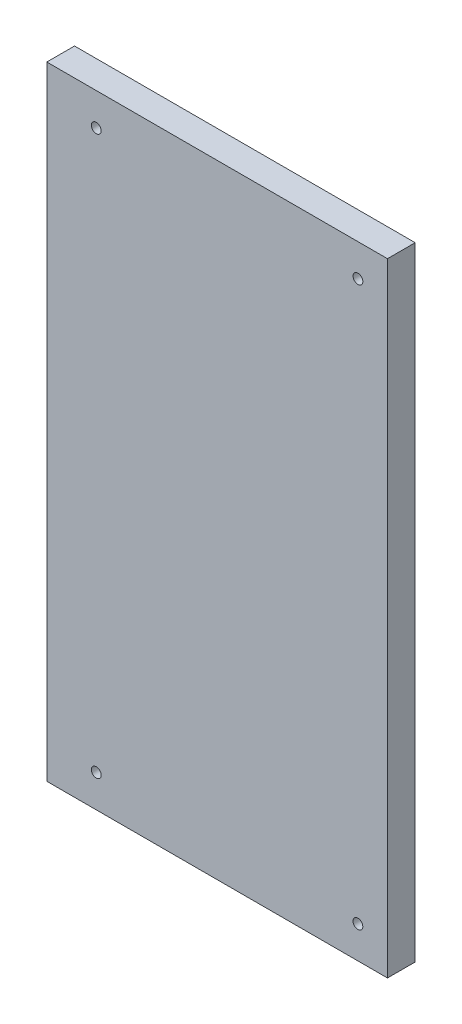
ISO-10303-21;
HEADER;
FILE_DESCRIPTION(('STEP AP214'),'2;1');
FILE_NAME('part.step','',(''),(''),'','','');
FILE_SCHEMA(('AUTOMOTIVE_DESIGN { 1 0 10303 214 1 1 1 1 }'));
ENDSEC;
DATA;
#1=APPLICATION_CONTEXT('core data for automotive mechanical design processes');
#2=APPLICATION_PROTOCOL_DEFINITION('international standard','automotive_design',2000,#1);
#3=PRODUCT_CONTEXT('',#1,'mechanical');
#4=PRODUCT('Part','Part','',(#3));
#5=PRODUCT_RELATED_PRODUCT_CATEGORY('part','',(#4));
#6=PRODUCT_DEFINITION_FORMATION('','',#4);
#7=PRODUCT_DEFINITION_CONTEXT('part definition',#1,'design');
#8=PRODUCT_DEFINITION('design','',#6,#7);
#9=PRODUCT_DEFINITION_SHAPE('','',#8);
#10=(LENGTH_UNIT() NAMED_UNIT(*) SI_UNIT(.MILLI.,.METRE.));
#11=(NAMED_UNIT(*) PLANE_ANGLE_UNIT() SI_UNIT($,.RADIAN.));
#12=(NAMED_UNIT(*) SI_UNIT($,.STERADIAN.) SOLID_ANGLE_UNIT());
#13=UNCERTAINTY_MEASURE_WITH_UNIT(LENGTH_MEASURE(1.E-05),#10,'distance_accuracy_value','');
#14=(GEOMETRIC_REPRESENTATION_CONTEXT(3) GLOBAL_UNCERTAINTY_ASSIGNED_CONTEXT((#13)) GLOBAL_UNIT_ASSIGNED_CONTEXT((#10,
#11,#12)) REPRESENTATION_CONTEXT('',''));
#15=CARTESIAN_POINT('',(0.,0.,0.));
#16=DIRECTION('',(0.,0.,1.));
#17=DIRECTION('',(1.,0.,0.));
#18=AXIS2_PLACEMENT_3D('',#15,#16,#17);
#19=CARTESIAN_POINT('',(-386.5646525714,417.112499999991,19.05));
#20=DIRECTION('',(1.,0.,0.));
#21=DIRECTION('',(0.,1.,0.));
#22=AXIS2_PLACEMENT_3D('',#19,#20,#21);
#23=PLANE('',#22);
#24=DIRECTION('',(0.,-1.,0.));
#25=VECTOR('',#24,1.);
#26=CARTESIAN_POINT('',(-386.5646525714,417.112499999991,0.));
#27=LINE('',#26,#25);
#28=CARTESIAN_POINT('',(-386.5646525714,417.112499999991,0.));
#29=VERTEX_POINT('',#28);
#30=CARTESIAN_POINT('',(-386.5646525714,-11.1124999999999,0.));
#31=VERTEX_POINT('',#30);
#32=EDGE_CURVE('E103',#29,#31,#27,.T.);
#33=ORIENTED_EDGE('',*,*,#32,.T.);
#34=DIRECTION('',(0.,0.,-1.));
#35=VECTOR('',#34,1.);
#36=CARTESIAN_POINT('',(-386.5646525714,-11.1124999999999,19.05));
#37=LINE('',#36,#35);
#38=CARTESIAN_POINT('',(-386.5646525714,-11.1124999999999,19.05));
#39=VERTEX_POINT('',#38);
#40=EDGE_CURVE('E11',#39,#31,#37,.T.);
#41=ORIENTED_EDGE('',*,*,#40,.F.);
#42=DIRECTION('',(0.,-1.,0.));
#43=VECTOR('',#42,1.);
#44=CARTESIAN_POINT('',(-386.5646525714,417.112499999991,19.05));
#45=LINE('',#44,#43);
#46=CARTESIAN_POINT('',(-386.5646525714,417.112499999991,19.05));
#47=VERTEX_POINT('',#46);
#48=EDGE_CURVE('E90',#47,#39,#45,.T.);
#49=ORIENTED_EDGE('',*,*,#48,.F.);
#50=DIRECTION('',(0.,0.,-1.));
#51=VECTOR('',#50,1.);
#52=CARTESIAN_POINT('',(-386.5646525714,417.112499999991,19.05));
#53=LINE('',#52,#51);
#54=EDGE_CURVE('E99',#47,#29,#53,.T.);
#55=ORIENTED_EDGE('',*,*,#54,.T.);
#56=EDGE_LOOP('',(#33,#41,#49,#55));
#57=FACE_BOUND('',#56,.T.);
#58=ADVANCED_FACE('F37',(#57),#23,.F.);
#59=CARTESIAN_POINT('',(-386.5646525714,-11.1124999999999,19.05));
#60=DIRECTION('',(0.,1.,0.));
#61=DIRECTION('',(0.,0.,1.));
#62=AXIS2_PLACEMENT_3D('',#59,#60,#61);
#63=PLANE('',#62);
#64=DIRECTION('',(1.,0.,0.));
#65=VECTOR('',#64,1.);
#66=CARTESIAN_POINT('',(-386.5646525714,-11.1124999999999,0.));
#67=LINE('',#66,#65);
#68=CARTESIAN_POINT('',(-152.388223356161,-11.1124999999999,0.));
#69=VERTEX_POINT('',#68);
#70=EDGE_CURVE('E94',#31,#69,#67,.T.);
#71=ORIENTED_EDGE('',*,*,#70,.T.);
#72=DIRECTION('',(0.,0.,-1.));
#73=VECTOR('',#72,1.);
#74=CARTESIAN_POINT('',(-152.388223356161,-11.1124999999999,19.05));
#75=LINE('',#74,#73);
#76=CARTESIAN_POINT('',(-152.388223356161,-11.1124999999999,19.05));
#77=VERTEX_POINT('',#76);
#78=EDGE_CURVE('E46',#77,#69,#75,.T.);
#79=ORIENTED_EDGE('',*,*,#78,.F.);
#80=DIRECTION('',(1.,0.,0.));
#81=VECTOR('',#80,1.);
#82=CARTESIAN_POINT('',(-386.5646525714,-11.1124999999999,19.05));
#83=LINE('',#82,#81);
#84=EDGE_CURVE('E85',#39,#77,#83,.T.);
#85=ORIENTED_EDGE('',*,*,#84,.F.);
#86=ORIENTED_EDGE('',*,*,#40,.T.);
#87=EDGE_LOOP('',(#71,#79,#85,#86));
#88=FACE_BOUND('',#87,.T.);
#89=ADVANCED_FACE('F93',(#88),#63,.F.);
#90=CARTESIAN_POINT('',(-152.388223356161,-11.1124999999999,19.05));
#91=DIRECTION('',(-1.,0.,0.));
#92=DIRECTION('',(0.,-1.,0.));
#93=AXIS2_PLACEMENT_3D('',#90,#91,#92);
#94=PLANE('',#93);
#95=DIRECTION('',(0.,1.,0.));
#96=VECTOR('',#95,1.);
#97=CARTESIAN_POINT('',(-152.388223356161,-11.1124999999999,0.));
#98=LINE('',#97,#96);
#99=CARTESIAN_POINT('',(-152.388223356161,417.112499999991,0.));
#100=VERTEX_POINT('',#99);
#101=EDGE_CURVE('E72',#69,#100,#98,.T.);
#102=ORIENTED_EDGE('',*,*,#101,.T.);
#103=DIRECTION('',(0.,0.,-1.));
#104=VECTOR('',#103,1.);
#105=CARTESIAN_POINT('',(-152.388223356161,417.112499999991,19.05));
#106=LINE('',#105,#104);
#107=CARTESIAN_POINT('',(-152.388223356161,417.112499999991,19.05));
#108=VERTEX_POINT('',#107);
#109=EDGE_CURVE('E95',#108,#100,#106,.T.);
#110=ORIENTED_EDGE('',*,*,#109,.F.);
#111=DIRECTION('',(0.,1.,0.));
#112=VECTOR('',#111,1.);
#113=CARTESIAN_POINT('',(-152.388223356161,-11.1124999999999,19.05));
#114=LINE('',#113,#112);
#115=EDGE_CURVE('E88',#77,#108,#114,.T.);
#116=ORIENTED_EDGE('',*,*,#115,.F.);
#117=ORIENTED_EDGE('',*,*,#78,.T.);
#118=EDGE_LOOP('',(#102,#110,#116,#117));
#119=FACE_BOUND('',#118,.T.);
#120=ADVANCED_FACE('F97',(#119),#94,.F.);
#121=CARTESIAN_POINT('',(-386.5646525714,417.112499999991,19.05));
#122=DIRECTION('',(0.,-1.,0.));
#123=DIRECTION('',(1.,0.,0.));
#124=AXIS2_PLACEMENT_3D('',#121,#122,#123);
#125=PLANE('',#124);
#126=DIRECTION('',(-1.,0.,0.));
#127=VECTOR('',#126,1.);
#128=CARTESIAN_POINT('',(-386.5646525714,417.112499999991,0.));
#129=LINE('',#128,#127);
#130=EDGE_CURVE('E78',#100,#29,#129,.T.);
#131=ORIENTED_EDGE('',*,*,#130,.T.);
#132=ORIENTED_EDGE('',*,*,#54,.F.);
#133=DIRECTION('',(-1.,0.,0.));
#134=VECTOR('',#133,1.);
#135=CARTESIAN_POINT('',(-386.5646525714,417.112499999991,19.05));
#136=LINE('',#135,#134);
#137=EDGE_CURVE('E55',#108,#47,#136,.T.);
#138=ORIENTED_EDGE('',*,*,#137,.F.);
#139=ORIENTED_EDGE('',*,*,#109,.T.);
#140=EDGE_LOOP('',(#131,#132,#138,#139));
#141=FACE_BOUND('',#140,.T.);
#142=ADVANCED_FACE('F151',(#141),#125,.F.);
#143=CARTESIAN_POINT('',(0.,0.,19.05));
#144=DIRECTION('',(0.,0.,1.));
#145=DIRECTION('',(1.,0.,0.));
#146=AXIS2_PLACEMENT_3D('',#143,#144,#145);
#147=PLANE('',#146);
#148=CARTESIAN_POINT('',(-352.582560938505,394.807308051609,19.0500000000006));
#149=DIRECTION('',(0.,0.,1.));
#150=DIRECTION('',(-1.,0.,0.));
#151=AXIS2_PLACEMENT_3D('',#148,#149,#150);
#152=CIRCLE('',#151,3.37819999999999);
#153=CARTESIAN_POINT('',(-355.960760938505,394.807308051609,19.0500000000006));
#154=VERTEX_POINT('',#153);
#155=EDGE_CURVE('E130',#154,#154,#152,.T.);
#156=ORIENTED_EDGE('',*,*,#155,.F.);
#157=EDGE_LOOP('',(#156));
#158=FACE_BOUND('',#157,.T.);
#159=CARTESIAN_POINT('',(-172.708223356151,395.014499999995,19.0500000000005));
#160=DIRECTION('',(0.,0.,1.));
#161=DIRECTION('',(-1.,0.,0.));
#162=AXIS2_PLACEMENT_3D('',#159,#160,#161);
#163=CIRCLE('',#162,3.36549999999999);
#164=CARTESIAN_POINT('',(-176.073723356151,395.014499999995,19.0500000000005));
#165=VERTEX_POINT('',#164);
#166=EDGE_CURVE('E120',#165,#165,#163,.T.);
#167=ORIENTED_EDGE('',*,*,#166,.F.);
#168=EDGE_LOOP('',(#167));
#169=FACE_BOUND('',#168,.T.);
#170=CARTESIAN_POINT('',(-352.582560938513,11.1926919483961,19.0500000000003));
#171=DIRECTION('',(0.,0.,-1.));
#172=DIRECTION('',(-1.,0.,0.));
#173=AXIS2_PLACEMENT_3D('',#170,#171,#172);
#174=CIRCLE('',#173,3.37819999999999);
#175=CARTESIAN_POINT('',(-355.960760938513,11.1926919483961,19.0500000000003));
#176=VERTEX_POINT('',#175);
#177=EDGE_CURVE('E117',#176,#176,#174,.T.);
#178=ORIENTED_EDGE('',*,*,#177,.T.);
#179=EDGE_LOOP('',(#178));
#180=FACE_BOUND('',#179,.T.);
#181=CARTESIAN_POINT('',(-172.708223356159,10.9855000000029,19.0500000000002));
#182=DIRECTION('',(0.,0.,-1.));
#183=DIRECTION('',(-1.,0.,0.));
#184=AXIS2_PLACEMENT_3D('',#181,#182,#183);
#185=CIRCLE('',#184,3.36549999999999);
#186=CARTESIAN_POINT('',(-176.073723356159,10.9855000000029,19.0500000000002));
#187=VERTEX_POINT('',#186);
#188=EDGE_CURVE('E114',#187,#187,#185,.T.);
#189=ORIENTED_EDGE('',*,*,#188,.T.);
#190=EDGE_LOOP('',(#189));
#191=FACE_BOUND('',#190,.T.);
#192=ORIENTED_EDGE('',*,*,#48,.T.);
#193=ORIENTED_EDGE('',*,*,#84,.T.);
#194=ORIENTED_EDGE('',*,*,#115,.T.);
#195=ORIENTED_EDGE('',*,*,#137,.T.);
#196=EDGE_LOOP('',(#192,#193,#194,#195));
#197=FACE_BOUND('',#196,.T.);
#198=ADVANCED_FACE('F86',(#158,#169,#180,#191,#197),#147,.T.);
#199=CARTESIAN_POINT('',(0.,0.,0.));
#200=DIRECTION('',(0.,0.,1.));
#201=DIRECTION('',(1.,0.,0.));
#202=AXIS2_PLACEMENT_3D('',#199,#200,#201);
#203=PLANE('',#202);
#204=CARTESIAN_POINT('',(-352.582560938505,394.807308051609,0.));
#205=DIRECTION('',(0.,0.,1.));
#206=DIRECTION('',(1.,0.,0.));
#207=AXIS2_PLACEMENT_3D('',#204,#205,#206);
#208=CIRCLE('',#207,3.37819999999999);
#209=CARTESIAN_POINT('',(-349.204360938505,394.807308051609,0.));
#210=VERTEX_POINT('',#209);
#211=EDGE_CURVE('E40',#210,#210,#208,.F.);
#212=ORIENTED_EDGE('',*,*,#211,.F.);
#213=EDGE_LOOP('',(#212));
#214=FACE_BOUND('',#213,.T.);
#215=CARTESIAN_POINT('',(-172.708223356151,395.014499999995,0.));
#216=DIRECTION('',(0.,0.,1.));
#217=DIRECTION('',(1.,0.,0.));
#218=AXIS2_PLACEMENT_3D('',#215,#216,#217);
#219=CIRCLE('',#218,3.36549999999999);
#220=CARTESIAN_POINT('',(-169.342723356151,395.014499999995,0.));
#221=VERTEX_POINT('',#220);
#222=EDGE_CURVE('E118',#221,#221,#219,.F.);
#223=ORIENTED_EDGE('',*,*,#222,.F.);
#224=EDGE_LOOP('',(#223));
#225=FACE_BOUND('',#224,.T.);
#226=CARTESIAN_POINT('',(-352.582560938513,11.1926919483961,0.));
#227=DIRECTION('',(0.,0.,1.));
#228=DIRECTION('',(1.,0.,0.));
#229=AXIS2_PLACEMENT_3D('',#226,#227,#228);
#230=CIRCLE('',#229,3.37819999999999);
#231=CARTESIAN_POINT('',(-349.204360938513,11.1926919483961,0.));
#232=VERTEX_POINT('',#231);
#233=EDGE_CURVE('E115',#232,#232,#230,.T.);
#234=ORIENTED_EDGE('',*,*,#233,.T.);
#235=EDGE_LOOP('',(#234));
#236=FACE_BOUND('',#235,.T.);
#237=CARTESIAN_POINT('',(-172.708223356159,10.9855000000028,0.));
#238=DIRECTION('',(0.,0.,1.));
#239=DIRECTION('',(1.,0.,0.));
#240=AXIS2_PLACEMENT_3D('',#237,#238,#239);
#241=CIRCLE('',#240,3.36549999999999);
#242=CARTESIAN_POINT('',(-169.342723356159,10.9855000000028,0.));
#243=VERTEX_POINT('',#242);
#244=EDGE_CURVE('E106',#243,#243,#241,.T.);
#245=ORIENTED_EDGE('',*,*,#244,.T.);
#246=EDGE_LOOP('',(#245));
#247=FACE_BOUND('',#246,.T.);
#248=ORIENTED_EDGE('',*,*,#32,.F.);
#249=ORIENTED_EDGE('',*,*,#130,.F.);
#250=ORIENTED_EDGE('',*,*,#101,.F.);
#251=ORIENTED_EDGE('',*,*,#70,.F.);
#252=EDGE_LOOP('',(#248,#249,#250,#251));
#253=FACE_BOUND('',#252,.T.);
#254=ADVANCED_FACE('F141',(#214,#225,#236,#247,#253),#203,.F.);
#255=CARTESIAN_POINT('',(-172.708223356159,10.9855000000029,19.0500000000002));
#256=DIRECTION('',(0.,0.,-1.));
#257=DIRECTION('',(-1.,0.,0.));
#258=AXIS2_PLACEMENT_3D('',#255,#256,#257);
#259=CYLINDRICAL_SURFACE('',#258,3.36549999999999);
#260=ORIENTED_EDGE('',*,*,#188,.F.);
#261=EDGE_LOOP('',(#260));
#262=FACE_BOUND('',#261,.T.);
#263=ORIENTED_EDGE('',*,*,#244,.F.);
#264=EDGE_LOOP('',(#263));
#265=FACE_BOUND('',#264,.T.);
#266=ADVANCED_FACE('F137',(#262,#265),#259,.F.);
#267=CARTESIAN_POINT('',(-352.582560938513,11.1926919483961,19.0500000000003));
#268=DIRECTION('',(0.,0.,-1.));
#269=DIRECTION('',(-1.,0.,0.));
#270=AXIS2_PLACEMENT_3D('',#267,#268,#269);
#271=CYLINDRICAL_SURFACE('',#270,3.37819999999999);
#272=ORIENTED_EDGE('',*,*,#177,.F.);
#273=EDGE_LOOP('',(#272));
#274=FACE_BOUND('',#273,.T.);
#275=ORIENTED_EDGE('',*,*,#233,.F.);
#276=EDGE_LOOP('',(#275));
#277=FACE_BOUND('',#276,.T.);
#278=ADVANCED_FACE('F140',(#274,#277),#271,.F.);
#279=CARTESIAN_POINT('',(-172.708223356151,395.014499999995,19.0500000000005));
#280=DIRECTION('',(0.,0.,-1.));
#281=DIRECTION('',(-1.,0.,0.));
#282=AXIS2_PLACEMENT_3D('',#279,#280,#281);
#283=CYLINDRICAL_SURFACE('',#282,3.36549999999999);
#284=ORIENTED_EDGE('',*,*,#166,.T.);
#285=EDGE_LOOP('',(#284));
#286=FACE_BOUND('',#285,.T.);
#287=ORIENTED_EDGE('',*,*,#222,.T.);
#288=EDGE_LOOP('',(#287));
#289=FACE_BOUND('',#288,.T.);
#290=ADVANCED_FACE('F195',(#286,#289),#283,.F.);
#291=CARTESIAN_POINT('',(-352.582560938505,394.807308051609,19.0500000000006));
#292=DIRECTION('',(0.,0.,-1.));
#293=DIRECTION('',(-1.,0.,0.));
#294=AXIS2_PLACEMENT_3D('',#291,#292,#293);
#295=CYLINDRICAL_SURFACE('',#294,3.37819999999999);
#296=ORIENTED_EDGE('',*,*,#155,.T.);
#297=EDGE_LOOP('',(#296));
#298=FACE_BOUND('',#297,.T.);
#299=ORIENTED_EDGE('',*,*,#211,.T.);
#300=EDGE_LOOP('',(#299));
#301=FACE_BOUND('',#300,.T.);
#302=ADVANCED_FACE('F218',(#298,#301),#295,.F.);
#303=CLOSED_SHELL('',(#58,#89,#120,#142,#198,#254,#266,#278,#290,#302));
#304=MANIFOLD_SOLID_BREP('B2',#303);
#305=ADVANCED_BREP_SHAPE_REPRESENTATION('',(#18,#304),#14);
#306=SHAPE_DEFINITION_REPRESENTATION(#9,#305);
ENDSEC;
END-ISO-10303-21;
